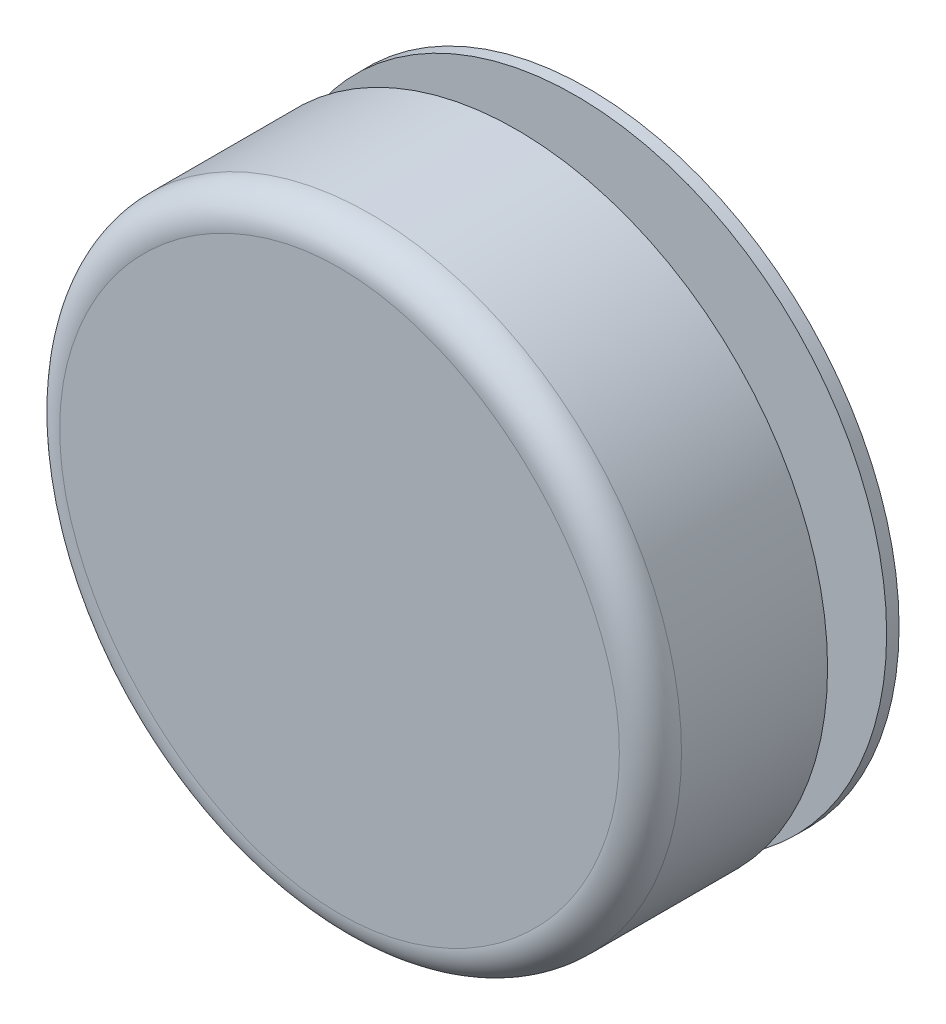
ISO-10303-21;
HEADER;
FILE_DESCRIPTION(('STEP AP214'),'2;1');
FILE_NAME('part.step','',(''),(''),'','','');
FILE_SCHEMA(('AUTOMOTIVE_DESIGN { 1 0 10303 214 1 1 1 1 }'));
ENDSEC;
DATA;
#1=APPLICATION_CONTEXT('core data for automotive mechanical design processes');
#2=APPLICATION_PROTOCOL_DEFINITION('international standard','automotive_design',2000,#1);
#3=PRODUCT_CONTEXT('',#1,'mechanical');
#4=PRODUCT('Part','Part','',(#3));
#5=PRODUCT_RELATED_PRODUCT_CATEGORY('part','',(#4));
#6=PRODUCT_DEFINITION_FORMATION('','',#4);
#7=PRODUCT_DEFINITION_CONTEXT('part definition',#1,'design');
#8=PRODUCT_DEFINITION('design','',#6,#7);
#9=PRODUCT_DEFINITION_SHAPE('','',#8);
#10=(LENGTH_UNIT() NAMED_UNIT(*) SI_UNIT(.MILLI.,.METRE.));
#11=(NAMED_UNIT(*) PLANE_ANGLE_UNIT() SI_UNIT($,.RADIAN.));
#12=(NAMED_UNIT(*) SI_UNIT($,.STERADIAN.) SOLID_ANGLE_UNIT());
#13=UNCERTAINTY_MEASURE_WITH_UNIT(LENGTH_MEASURE(1.E-05),#10,'distance_accuracy_value','');
#14=(GEOMETRIC_REPRESENTATION_CONTEXT(3) GLOBAL_UNCERTAINTY_ASSIGNED_CONTEXT((#13)) GLOBAL_UNIT_ASSIGNED_CONTEXT((#10,
#11,#12)) REPRESENTATION_CONTEXT('',''));
#15=CARTESIAN_POINT('',(0.,0.,0.));
#16=DIRECTION('',(0.,0.,1.));
#17=DIRECTION('',(1.,0.,0.));
#18=AXIS2_PLACEMENT_3D('',#15,#16,#17);
#19=CARTESIAN_POINT('',(0.,0.,1.08));
#20=DIRECTION('',(0.,0.,1.));
#21=DIRECTION('',(-1.,0.,0.));
#22=AXIS2_PLACEMENT_3D('',#19,#20,#21);
#23=CYLINDRICAL_SURFACE('',#22,1.);
#24=CARTESIAN_POINT('',(0.,0.,0.74));
#25=DIRECTION('',(0.,0.,-1.));
#26=DIRECTION('',(-1.,0.,0.));
#27=AXIS2_PLACEMENT_3D('',#24,#25,#26);
#28=CIRCLE('',#27,1.);
#29=CARTESIAN_POINT('',(1.,0.,0.74));
#30=VERTEX_POINT('',#29);
#31=EDGE_CURVE('E11',#30,#30,#28,.T.);
#32=ORIENTED_EDGE('',*,*,#31,.T.);
#33=CARTESIAN_POINT('',(1.,0.,0.7));
#34=CARTESIAN_POINT('',(1.,0.,0.74));
#35=B_SPLINE_CURVE_WITH_KNOTS('',1,(#33,#34),.UNSPECIFIED.,.F.,.F.,(2,2),(-0.38,-0.34),.UNSPECIFIED.);
#36=CARTESIAN_POINT('',(1.,0.,0.7));
#37=VERTEX_POINT('',#36);
#38=EDGE_CURVE('E24',#37,#30,#35,.T.);
#39=ORIENTED_EDGE('',*,*,#38,.F.);
#40=CARTESIAN_POINT('',(0.,0.,0.7));
#41=DIRECTION('',(0.,0.,1.));
#42=DIRECTION('',(-1.,0.,0.));
#43=AXIS2_PLACEMENT_3D('',#40,#41,#42);
#44=CIRCLE('',#43,1.);
#45=EDGE_CURVE('E156',#37,#37,#44,.T.);
#46=ORIENTED_EDGE('',*,*,#45,.T.);
#47=ORIENTED_EDGE('',*,*,#38,.T.);
#48=EDGE_LOOP('',(#32,#39,#46,#47));
#49=FACE_BOUND('',#48,.T.);
#50=ADVANCED_FACE('F17',(#49),#23,.T.);
#51=CARTESIAN_POINT('',(-2.47,-2.47,0.74));
#52=DIRECTION('',(0.,0.,1.));
#53=DIRECTION('',(1.,0.,0.));
#54=AXIS2_PLACEMENT_3D('',#51,#52,#53);
#55=PLANE('',#54);
#56=ORIENTED_EDGE('',*,*,#31,.F.);
#57=EDGE_LOOP('',(#56));
#58=FACE_BOUND('',#57,.T.);
#59=CARTESIAN_POINT('',(0.,0.,0.74000000001));
#60=DIRECTION('',(0.,0.,1.));
#61=DIRECTION('',(-1.,0.,0.));
#62=AXIS2_PLACEMENT_3D('',#59,#60,#61);
#63=CIRCLE('',#62,0.43);
#64=CARTESIAN_POINT('',(-0.43,1.00888178061735E-11,0.74000000001));
#65=VERTEX_POINT('',#64);
#66=CARTESIAN_POINT('',(0.430000000068744,0.,0.739999999803768));
#67=VERTEX_POINT('',#66);
#68=EDGE_CURVE('E57',#65,#67,#63,.T.);
#69=ORIENTED_EDGE('',*,*,#68,.F.);
#70=EDGE_CURVE('E155',#67,#65,#63,.T.);
#71=ORIENTED_EDGE('',*,*,#70,.F.);
#72=EDGE_LOOP('',(#69,#71));
#73=FACE_BOUND('',#72,.T.);
#74=ADVANCED_FACE('F145',(#58,#73),#55,.T.);
#75=CARTESIAN_POINT('',(-2.47,-2.47,0.7));
#76=DIRECTION('',(0.,0.,1.));
#77=DIRECTION('',(1.,0.,0.));
#78=AXIS2_PLACEMENT_3D('',#75,#76,#77);
#79=PLANE('',#78);
#80=ORIENTED_EDGE('',*,*,#45,.F.);
#81=EDGE_LOOP('',(#80));
#82=FACE_BOUND('',#81,.T.);
#83=ADVANCED_FACE('F99',(#82),#79,.F.);
#84=CARTESIAN_POINT('',(0.,0.,1.4));
#85=DIRECTION('',(0.,0.,1.));
#86=DIRECTION('',(1.,0.,0.));
#87=AXIS2_PLACEMENT_3D('',#84,#85,#86);
#88=TOROIDAL_SURFACE('',#87,0.9,0.1);
#89=CARTESIAN_POINT('',(-0.90000000001,-1.00606372191447E-11,1.5));
#90=CARTESIAN_POINT('',(-0.900360632176096,-0.106897377076426,1.5));
#91=CARTESIAN_POINT('',(-0.878645312852639,-0.213558576952074,1.5));
#92=CARTESIAN_POINT('',(-0.832004430276648,-0.32293812499375,1.5));
#93=CARTESIAN_POINT('',(-0.785363547700657,-0.432317673035427,1.5));
#94=CARTESIAN_POINT('',(-0.716866526564594,-0.534428433801622,1.5));
#95=CARTESIAN_POINT('',(-0.626686950665048,-0.624807178365202,1.5));
#96=CARTESIAN_POINT('',(-0.536507374765502,-0.715185922928782,1.5));
#97=CARTESIAN_POINT('',(-0.433889290309788,-0.78381335499319,1.5));
#98=CARTESIAN_POINT('',(-0.324334657432229,-0.830988747361594,1.5));
#99=CARTESIAN_POINT('',(-0.214780024554669,-0.878164139729999,1.5));
#100=CARTESIAN_POINT('',(-0.107562547562089,-0.899910367113916,1.5));
#101=CARTESIAN_POINT('',(0.00108602280260699,-0.899934353038635,1.5));
#102=CARTESIAN_POINT('',(0.109734593167,-0.899958338963354,1.5));
#103=CARTESIAN_POINT('',(0.217457136851,-0.877912888097026,1.5));
#104=CARTESIAN_POINT('',(0.327151056661,-0.831019769298321,1.5));
#105=CARTESIAN_POINT('',(0.43684497647,-0.784126650499616,1.5));
#106=CARTESIAN_POINT('',(0.538729957321,-0.715574689615176,1.5));
#107=CARTESIAN_POINT('',(0.628318983196,-0.626045947190721,1.5));
#108=CARTESIAN_POINT('',(0.717908009071,-0.536517204766266,1.5));
#109=CARTESIAN_POINT('',(0.785606578147,-0.435138023162714,1.5));
#110=CARTESIAN_POINT('',(0.832142926505,-0.325831840187427,1.5));
#111=CARTESIAN_POINT('',(0.878679274864,-0.216525657212141,1.5));
#112=CARTESIAN_POINT('',(0.900364060995,-0.108878749692318,1.5));
#113=CARTESIAN_POINT('',(0.90000000001,0.,1.5));
#114=B_SPLINE_CURVE_WITH_KNOTS('',3,(#89,#90,#91,#92,#93,#94,#95,#96,#97,#98,#99,#100,#101,#102,
#103,#104,#105,#106,#107,#108,#109,#110,#111,#112,#113),.UNSPECIFIED.,.F.,.F.,(4,3,3,3,3,3,3,3,
4),(0.,0.125,0.25,0.375,0.5,0.625,0.75,0.875,1.),.UNSPECIFIED.);
#115=CARTESIAN_POINT('',(-0.9,0.,1.5));
#116=VERTEX_POINT('',#115);
#117=CARTESIAN_POINT('',(0.9,0.,1.5));
#118=VERTEX_POINT('',#117);
#119=EDGE_CURVE('E115',#116,#118,#114,.T.);
#120=ORIENTED_EDGE('',*,*,#119,.F.);
#121=CARTESIAN_POINT('',(0.90000000001,0.,1.5));
#122=CARTESIAN_POINT('',(0.900360632176,0.106897377073,1.5));
#123=CARTESIAN_POINT('',(0.878645312852,0.213558576952,1.5));
#124=CARTESIAN_POINT('',(0.832004430277,0.322938124994,1.5));
#125=CARTESIAN_POINT('',(0.785363547701,0.432317673035,1.5));
#126=CARTESIAN_POINT('',(0.716866526565,0.534428433801,1.5));
#127=CARTESIAN_POINT('',(0.626686950665,0.624807178365,1.5));
#128=CARTESIAN_POINT('',(0.536507374765,0.715185922929,1.5));
#129=CARTESIAN_POINT('',(0.433889290309,0.783813354993,1.5));
#130=CARTESIAN_POINT('',(0.324334657432,0.830988747362,1.5));
#131=CARTESIAN_POINT('',(0.214780024554,0.87816413973,1.5));
#132=CARTESIAN_POINT('',(0.107562547562,0.899910367114,1.5));
#133=CARTESIAN_POINT('',(-0.00108602280279239,0.899934353039,1.5));
#134=CARTESIAN_POINT('',(-0.109734593167305,0.899958338963,1.5));
#135=CARTESIAN_POINT('',(-0.217457136850823,0.877912888097,1.5));
#136=CARTESIAN_POINT('',(-0.327151056660506,0.831019769298,1.5));
#137=CARTESIAN_POINT('',(-0.436844976470188,0.784126650499,1.5));
#138=CARTESIAN_POINT('',(-0.538729957321293,0.715574689615,1.5));
#139=CARTESIAN_POINT('',(-0.62831898319626,0.62604594719,1.5));
#140=CARTESIAN_POINT('',(-0.717908009071227,0.536517204766,1.5));
#141=CARTESIAN_POINT('',(-0.785606578146833,0.435138023162,1.5));
#142=CARTESIAN_POINT('',(-0.832142926505271,0.325831840187,1.5));
#143=CARTESIAN_POINT('',(-0.87867927486371,0.216525657212,1.5));
#144=CARTESIAN_POINT('',(-0.900364060993664,0.108878749699,1.5));
#145=CARTESIAN_POINT('',(-0.900000000010033,0.,1.5));
#146=B_SPLINE_CURVE_WITH_KNOTS('',3,(#121,#122,#123,#124,#125,#126,#127,#128,#129,#130,#131,
#132,#133,#134,#135,#136,#137,#138,#139,#140,#141,#142,#143,#144,#145),.UNSPECIFIED.,.F.,.F.,(4,
3,3,3,3,3,3,3,4),(0.,0.125,0.25,0.375,0.5,0.625,0.75,0.875,1.),.UNSPECIFIED.);
#147=EDGE_CURVE('E82',#118,#116,#146,.T.);
#148=ORIENTED_EDGE('',*,*,#147,.F.);
#149=CARTESIAN_POINT('',(0.999999999999567,0.,1.40000000000017));
#150=CARTESIAN_POINT('',(0.999999999999806,0.,1.42673367831338));
#151=CARTESIAN_POINT('',(0.991499564937749,0.,1.45277085725516));
#152=CARTESIAN_POINT('',(0.975191951323402,0.,1.47519195131552));
#153=CARTESIAN_POINT('',(0.952770857263961,0.,1.49149956493238));
#154=CARTESIAN_POINT('',(0.926733678323518,0.,1.49999999999773));
#155=CARTESIAN_POINT('',(0.90000000001,0.,1.49999999999983));
#156=(BOUNDED_CURVE() B_SPLINE_CURVE(6,(#149,#150,#151,#152,#153,#154,#155),.UNSPECIFIED.,.F.,
.F.) B_SPLINE_CURVE_WITH_KNOTS((7,7),(0.,1.5707963266949),
.UNSPECIFIED.) CURVE() GEOMETRIC_REPRESENTATION_ITEM() RATIONAL_B_SPLINE_CURVE((1.03139347178345,
1.0100254076602,0.99792464272524,0.993958444137677,0.997924642725242,1.01002540766019,1.03139347178345)) REPRESENTATION_ITEM(''));
#157=CARTESIAN_POINT('',(1.00000000001,0.,1.40000000001));
#158=VERTEX_POINT('',#157);
#159=EDGE_CURVE('E62',#158,#118,#156,.T.);
#160=ORIENTED_EDGE('',*,*,#159,.F.);
#161=CARTESIAN_POINT('',(0.,0.,1.40000000001));
#162=DIRECTION('',(0.,0.,-1.));
#163=DIRECTION('',(1.,0.,0.));
#164=AXIS2_PLACEMENT_3D('',#161,#162,#163);
#165=CIRCLE('',#164,1.);
#166=EDGE_CURVE('E59',#158,#158,#165,.T.);
#167=ORIENTED_EDGE('',*,*,#166,.F.);
#168=ORIENTED_EDGE('',*,*,#159,.T.);
#169=EDGE_LOOP('',(#120,#148,#160,#167,#168));
#170=FACE_BOUND('',#169,.T.);
#171=ADVANCED_FACE('F89',(#170),#88,.T.);
#172=CARTESIAN_POINT('',(0.,0.,0.8349999997803));
#173=DIRECTION('',(0.,0.,1.));
#174=DIRECTION('',(1.,0.,0.));
#175=AXIS2_PLACEMENT_3D('',#172,#173,#174);
#176=CONICAL_SURFACE('',#175,0.715,1.2490457724);
#177=ORIENTED_EDGE('',*,*,#68,.T.);
#178=CARTESIAN_POINT('',(0.430000000068744,0.,0.739999999803768));
#179=CARTESIAN_POINT('',(1.000000000661,0.,0.93));
#180=B_SPLINE_CURVE_WITH_KNOTS('',1,(#178,#179),.UNSPECIFIED.,.F.,.F.,(2,2),(-0.300416377643359,
0.300416378412323),.UNSPECIFIED.);
#181=CARTESIAN_POINT('',(1.000000000182,0.,0.929999999707));
#182=VERTEX_POINT('',#181);
#183=EDGE_CURVE('E52',#67,#182,#180,.T.);
#184=ORIENTED_EDGE('',*,*,#183,.T.);
#185=CARTESIAN_POINT('',(0.,0.,0.93));
#186=DIRECTION('',(0.,0.,-1.));
#187=DIRECTION('',(1.,0.,0.));
#188=AXIS2_PLACEMENT_3D('',#185,#186,#187);
#189=CIRCLE('',#188,1.000000000661);
#190=EDGE_CURVE('E55',#182,#182,#189,.T.);
#191=ORIENTED_EDGE('',*,*,#190,.T.);
#192=ORIENTED_EDGE('',*,*,#183,.F.);
#193=ORIENTED_EDGE('',*,*,#70,.T.);
#194=EDGE_LOOP('',(#177,#184,#191,#192,#193));
#195=FACE_BOUND('',#194,.T.);
#196=ADVANCED_FACE('F53',(#195),#176,.T.);
#197=CARTESIAN_POINT('',(-0.936,-0.936,1.5));
#198=DIRECTION('',(0.,0.,1.));
#199=DIRECTION('',(1.,0.,0.));
#200=AXIS2_PLACEMENT_3D('',#197,#198,#199);
#201=PLANE('',#200);
#202=ORIENTED_EDGE('',*,*,#119,.T.);
#203=ORIENTED_EDGE('',*,*,#147,.T.);
#204=EDGE_LOOP('',(#202,#203));
#205=FACE_BOUND('',#204,.T.);
#206=ADVANCED_FACE('F120',(#205),#201,.T.);
#207=CARTESIAN_POINT('',(0.,0.,1.073599999654));
#208=DIRECTION('',(0.,0.,-1.));
#209=DIRECTION('',(1.,0.,0.));
#210=AXIS2_PLACEMENT_3D('',#207,#208,#209);
#211=CYLINDRICAL_SURFACE('',#210,1.);
#212=ORIENTED_EDGE('',*,*,#190,.F.);
#213=CARTESIAN_POINT('',(1.,0.,1.40000000001));
#214=CARTESIAN_POINT('',(1.,0.,0.93));
#215=B_SPLINE_CURVE_WITH_KNOTS('',1,(#213,#214),.UNSPECIFIED.,.F.,.F.,(2,2),(-0.326400000356,
0.143599999654),.UNSPECIFIED.);
#216=EDGE_CURVE('E64',#158,#182,#215,.T.);
#217=ORIENTED_EDGE('',*,*,#216,.F.);
#218=ORIENTED_EDGE('',*,*,#166,.T.);
#219=ORIENTED_EDGE('',*,*,#216,.T.);
#220=EDGE_LOOP('',(#212,#217,#218,#219));
#221=FACE_BOUND('',#220,.T.);
#222=ADVANCED_FACE('F129',(#221),#211,.T.);
#223=CLOSED_SHELL('',(#50,#74,#83,#171,#196,#206,#222));
#224=MANIFOLD_SOLID_BREP('B1',#223);
#225=ADVANCED_BREP_SHAPE_REPRESENTATION('',(#18,#224),#14);
#226=SHAPE_DEFINITION_REPRESENTATION(#9,#225);
ENDSEC;
END-ISO-10303-21;
